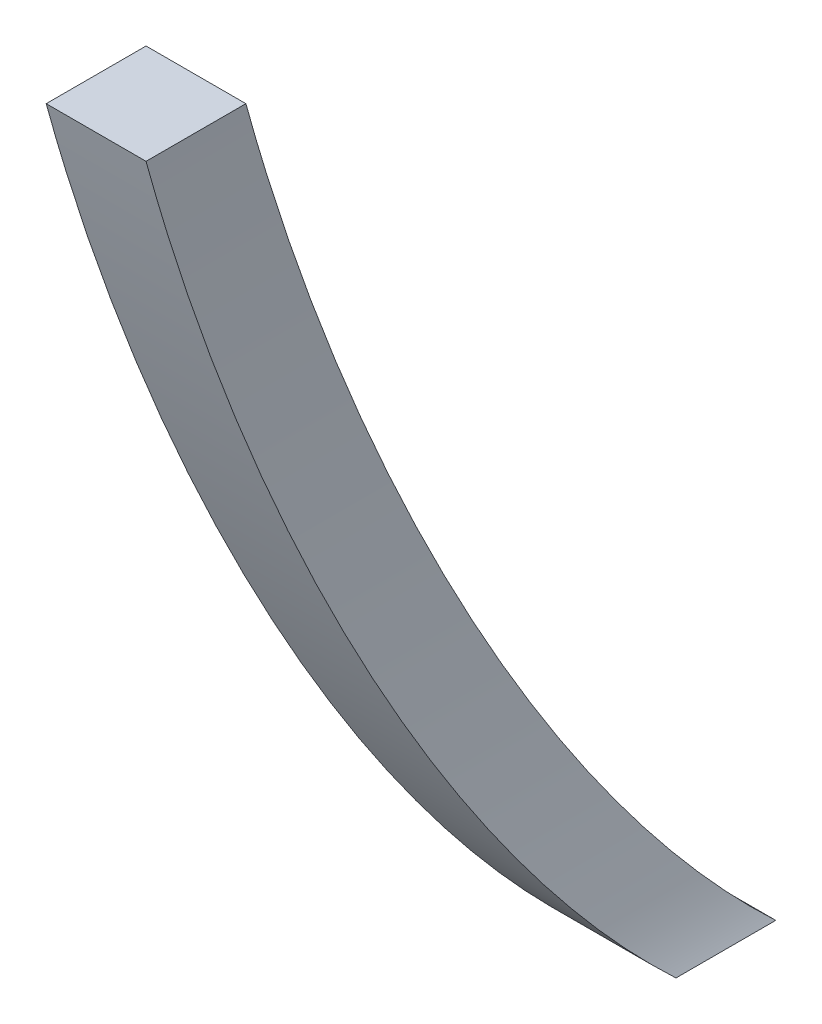
ISO-10303-21;
HEADER;
FILE_DESCRIPTION(('STEP AP214'),'2;1');
FILE_NAME('part.step','',(''),(''),'','','');
FILE_SCHEMA(('AUTOMOTIVE_DESIGN { 1 0 10303 214 1 1 1 1 }'));
ENDSEC;
DATA;
#1=APPLICATION_CONTEXT('core data for automotive mechanical design processes');
#2=APPLICATION_PROTOCOL_DEFINITION('international standard','automotive_design',2000,#1);
#3=PRODUCT_CONTEXT('',#1,'mechanical');
#4=PRODUCT('Part','Part','',(#3));
#5=PRODUCT_RELATED_PRODUCT_CATEGORY('part','',(#4));
#6=PRODUCT_DEFINITION_FORMATION('','',#4);
#7=PRODUCT_DEFINITION_CONTEXT('part definition',#1,'design');
#8=PRODUCT_DEFINITION('design','',#6,#7);
#9=PRODUCT_DEFINITION_SHAPE('','',#8);
#10=(LENGTH_UNIT() NAMED_UNIT(*) SI_UNIT(.MILLI.,.METRE.));
#11=(NAMED_UNIT(*) PLANE_ANGLE_UNIT() SI_UNIT($,.RADIAN.));
#12=(NAMED_UNIT(*) SI_UNIT($,.STERADIAN.) SOLID_ANGLE_UNIT());
#13=UNCERTAINTY_MEASURE_WITH_UNIT(LENGTH_MEASURE(1.E-05),#10,'distance_accuracy_value','');
#14=(GEOMETRIC_REPRESENTATION_CONTEXT(3) GLOBAL_UNCERTAINTY_ASSIGNED_CONTEXT((#13)) GLOBAL_UNIT_ASSIGNED_CONTEXT((#10,
#11,#12)) REPRESENTATION_CONTEXT('',''));
#15=CARTESIAN_POINT('',(0.,0.,0.));
#16=DIRECTION('',(0.,0.,1.));
#17=DIRECTION('',(1.,0.,0.));
#18=AXIS2_PLACEMENT_3D('',#15,#16,#17);
#19=CARTESIAN_POINT('',(0.,0.,0.));
#20=DIRECTION('',(0.,1.,0.));
#21=DIRECTION('',(0.,0.,-1.));
#22=AXIS2_PLACEMENT_3D('',#19,#20,#21);
#23=PLANE('',#22);
#24=DIRECTION('',(0.,0.,-1.));
#25=VECTOR('',#24,1.);
#26=CARTESIAN_POINT('',(15.,0.,15.));
#27=LINE('',#26,#25);
#28=CARTESIAN_POINT('',(15.,0.,15.));
#29=VERTEX_POINT('',#28);
#30=CARTESIAN_POINT('',(15.,0.,-15.));
#31=VERTEX_POINT('',#30);
#32=EDGE_CURVE('E85',#29,#31,#27,.T.);
#33=ORIENTED_EDGE('',*,*,#32,.T.);
#34=DIRECTION('',(-1.,0.,0.));
#35=VECTOR('',#34,1.);
#36=CARTESIAN_POINT('',(-15.,0.,-15.));
#37=LINE('',#36,#35);
#38=CARTESIAN_POINT('',(-15.,0.,-15.));
#39=VERTEX_POINT('',#38);
#40=EDGE_CURVE('E176',#31,#39,#37,.T.);
#41=ORIENTED_EDGE('',*,*,#40,.T.);
#42=DIRECTION('',(0.,0.,1.));
#43=VECTOR('',#42,1.);
#44=CARTESIAN_POINT('',(-15.,0.,15.));
#45=LINE('',#44,#43);
#46=CARTESIAN_POINT('',(-15.,0.,15.));
#47=VERTEX_POINT('',#46);
#48=EDGE_CURVE('E47',#39,#47,#45,.T.);
#49=ORIENTED_EDGE('',*,*,#48,.T.);
#50=DIRECTION('',(1.,0.,0.));
#51=VECTOR('',#50,1.);
#52=CARTESIAN_POINT('',(-15.,0.,15.));
#53=LINE('',#52,#51);
#54=EDGE_CURVE('E11',#47,#29,#53,.T.);
#55=ORIENTED_EDGE('',*,*,#54,.T.);
#56=EDGE_LOOP('',(#33,#41,#49,#55));
#57=FACE_BOUND('',#56,.T.);
#58=ADVANCED_FACE('F37',(#57),#23,.T.);
#59=CARTESIAN_POINT('',(0.,-250.,0.));
#60=DIRECTION('',(0.,1.,0.));
#61=DIRECTION('',(0.,0.,-1.));
#62=AXIS2_PLACEMENT_3D('',#59,#60,#61);
#63=PLANE('',#62);
#64=DIRECTION('',(0.,0.,-1.));
#65=VECTOR('',#64,1.);
#66=CARTESIAN_POINT('',(57.129910507299,-250.,-102.090339112419));
#67=LINE('',#66,#65);
#68=CARTESIAN_POINT('',(57.129910507299,-250.,-102.090339112419));
#69=VERTEX_POINT('',#68);
#70=CARTESIAN_POINT('',(57.129910507299,-250.,-132.090339112419));
#71=VERTEX_POINT('',#70);
#72=EDGE_CURVE('E103',#69,#71,#67,.T.);
#73=ORIENTED_EDGE('',*,*,#72,.F.);
#74=DIRECTION('',(1.,0.,0.));
#75=VECTOR('',#74,1.);
#76=CARTESIAN_POINT('',(27.129910507299,-250.,-102.090339112419));
#77=LINE('',#76,#75);
#78=CARTESIAN_POINT('',(27.129910507299,-250.,-102.090339112419));
#79=VERTEX_POINT('',#78);
#80=EDGE_CURVE('E80',#79,#69,#77,.T.);
#81=ORIENTED_EDGE('',*,*,#80,.F.);
#82=DIRECTION('',(0.,0.,1.));
#83=VECTOR('',#82,1.);
#84=CARTESIAN_POINT('',(27.129910507299,-250.,-102.090339112419));
#85=LINE('',#84,#83);
#86=CARTESIAN_POINT('',(27.129910507299,-250.,-132.090339112419));
#87=VERTEX_POINT('',#86);
#88=EDGE_CURVE('E88',#87,#79,#85,.T.);
#89=ORIENTED_EDGE('',*,*,#88,.F.);
#90=DIRECTION('',(-1.,0.,0.));
#91=VECTOR('',#90,1.);
#92=CARTESIAN_POINT('',(27.129910507299,-250.,-132.090339112419));
#93=LINE('',#92,#91);
#94=EDGE_CURVE('E96',#71,#87,#93,.T.);
#95=ORIENTED_EDGE('',*,*,#94,.F.);
#96=EDGE_LOOP('',(#73,#81,#89,#95));
#97=FACE_BOUND('',#96,.T.);
#98=ADVANCED_FACE('F101',(#97),#63,.F.);
#99=CARTESIAN_POINT('',(57.129910507299,-250.,-102.090339112419));
#100=CARTESIAN_POINT('',(25.0597234393868,-210.441936205879,-58.1589943773229));
#101=CARTESIAN_POINT('',(13.459178000519,-97.1565526695312,-12.590765320135));
#102=CARTESIAN_POINT('',(15.,0.,15.));
#103=CARTESIAN_POINT('',(54.6299105072989,-250.,-102.090339112419));
#104=CARTESIAN_POINT('',(22.5597234393868,-210.441936205879,-58.1589943773229));
#105=CARTESIAN_POINT('',(10.959178000519,-97.1565526695312,-12.590765320135));
#106=CARTESIAN_POINT('',(12.5,0.,15.));
#107=CARTESIAN_POINT('',(49.629910507299,-250.000000000001,-102.090339112419));
#108=CARTESIAN_POINT('',(17.5597234393868,-210.441936205879,-58.1589943773229));
#109=CARTESIAN_POINT('',(5.95917800051906,-97.1565526695314,-12.590765320135));
#110=CARTESIAN_POINT('',(7.5,0.,15.));
#111=CARTESIAN_POINT('',(42.1299105072989,-250.,-102.090339112419));
#112=CARTESIAN_POINT('',(10.0597234393867,-210.441936205878,-58.1589943773229));
#113=CARTESIAN_POINT('',(-1.54082199948099,-97.156552669531,-12.590765320135));
#114=CARTESIAN_POINT('',(0.,0.,15.));
#115=CARTESIAN_POINT('',(34.629910507299,-250.,-102.090339112419));
#116=CARTESIAN_POINT('',(2.5597234393868,-210.441936205879,-58.1589943773229));
#117=CARTESIAN_POINT('',(-9.04082199948095,-97.1565526695313,-12.590765320135));
#118=CARTESIAN_POINT('',(-7.5,0.,15.));
#119=CARTESIAN_POINT('',(29.629910507299,-250.,-102.090339112419));
#120=CARTESIAN_POINT('',(-2.44027656061323,-210.441936205879,-58.1589943773229));
#121=CARTESIAN_POINT('',(-14.040821999481,-97.1565526695312,-12.590765320135));
#122=CARTESIAN_POINT('',(-12.5,0.,15.));
#123=CARTESIAN_POINT('',(27.129910507299,-250.,-102.090339112419));
#124=CARTESIAN_POINT('',(-4.94027656061323,-210.441936205879,-58.1589943773229));
#125=CARTESIAN_POINT('',(-16.540821999481,-97.1565526695312,-12.590765320135));
#126=CARTESIAN_POINT('',(-15.,0.,15.));
#127=B_SPLINE_SURFACE_WITH_KNOTS('',3,3,((#99,#100,#101,#102),(#103,#104,#105,#106),(#107,#108,
#109,#110),(#111,#112,#113,#114),(#115,#116,#117,#118),(#119,#120,#121,#122),(#123,#124,#125,
#126)),.UNSPECIFIED.,.F.,.F.,.F.,(4,1,1,1,4),(4,4),(0.75,0.8125,0.875,0.9375,1.),(0.,1.),.UNSPECIFIED.);
#128=CARTESIAN_POINT('',(57.129910507299,-250.,-102.090339112419));
#129=CARTESIAN_POINT('',(25.0597234393868,-210.441936205879,-58.1589943773229));
#130=CARTESIAN_POINT('',(13.459178000519,-97.1565526695312,-12.590765320135));
#131=CARTESIAN_POINT('',(15.,0.,15.));
#132=B_SPLINE_CURVE_WITH_KNOTS('',3,(#128,#129,#130,#131),.UNSPECIFIED.,.F.,.F.,(4,4),(0.,1.),.UNSPECIFIED.);
#133=EDGE_CURVE('E55',#69,#29,#132,.T.);
#134=CARTESIAN_POINT('',(27.129910507299,-250.,-102.090339112419));
#135=CARTESIAN_POINT('',(-4.94027656061323,-210.441936205879,-58.1589943773229));
#136=CARTESIAN_POINT('',(-16.540821999481,-97.1565526695312,-12.590765320135));
#137=CARTESIAN_POINT('',(-15.,0.,15.));
#138=B_SPLINE_CURVE_WITH_KNOTS('',3,(#134,#135,#136,#137),.UNSPECIFIED.,.F.,.F.,(4,4),(0.,1.),.UNSPECIFIED.);
#139=EDGE_CURVE('E62',#79,#47,#138,.T.);
#140=ORIENTED_EDGE('',*,*,#80,.T.);
#141=ORIENTED_EDGE('',*,*,#133,.T.);
#142=ORIENTED_EDGE('',*,*,#54,.F.);
#143=ORIENTED_EDGE('',*,*,#139,.F.);
#144=EDGE_LOOP('',(#140,#141,#142,#143));
#145=FACE_BOUND('',#144,.T.);
#146=ADVANCED_FACE('F78',(#145),#127,.F.);
#147=CARTESIAN_POINT('',(57.129910507299,-250.,-132.090339112419));
#148=CARTESIAN_POINT('',(25.0597234393868,-210.441936205879,-88.1589943773229));
#149=CARTESIAN_POINT('',(13.459178000519,-97.1565526695312,-42.590765320135));
#150=CARTESIAN_POINT('',(15.,0.,-15.));
#151=CARTESIAN_POINT('',(57.129910507299,-250.,-129.590339112419));
#152=CARTESIAN_POINT('',(25.0597234393868,-210.441936205879,-85.6589943773229));
#153=CARTESIAN_POINT('',(13.459178000519,-97.1565526695312,-40.090765320135));
#154=CARTESIAN_POINT('',(15.,0.,-12.5));
#155=CARTESIAN_POINT('',(57.129910507299,-250.000000000001,-124.590339112419));
#156=CARTESIAN_POINT('',(25.0597234393868,-210.441936205879,-80.658994377323));
#157=CARTESIAN_POINT('',(13.4591780005191,-97.1565526695314,-35.090765320135));
#158=CARTESIAN_POINT('',(15.,0.,-7.5));
#159=CARTESIAN_POINT('',(57.1299105072989,-250.,-117.090339112419));
#160=CARTESIAN_POINT('',(25.0597234393868,-210.441936205878,-73.1589943773229));
#161=CARTESIAN_POINT('',(13.459178000519,-97.156552669531,-27.590765320135));
#162=CARTESIAN_POINT('',(15.,0.,0.));
#163=CARTESIAN_POINT('',(57.129910507299,-250.,-109.590339112419));
#164=CARTESIAN_POINT('',(25.0597234393868,-210.441936205879,-65.6589943773229));
#165=CARTESIAN_POINT('',(13.459178000519,-97.1565526695313,-20.090765320135));
#166=CARTESIAN_POINT('',(15.,0.,7.50000000000001));
#167=CARTESIAN_POINT('',(57.129910507299,-250.,-104.590339112419));
#168=CARTESIAN_POINT('',(25.0597234393868,-210.441936205879,-60.6589943773229));
#169=CARTESIAN_POINT('',(13.459178000519,-97.1565526695312,-15.090765320135));
#170=CARTESIAN_POINT('',(15.,0.,12.5));
#171=CARTESIAN_POINT('',(57.129910507299,-250.,-102.090339112419));
#172=CARTESIAN_POINT('',(25.0597234393868,-210.441936205879,-58.1589943773229));
#173=CARTESIAN_POINT('',(13.459178000519,-97.1565526695312,-12.590765320135));
#174=CARTESIAN_POINT('',(15.,0.,15.));
#175=B_SPLINE_SURFACE_WITH_KNOTS('',3,3,((#147,#148,#149,#150),(#151,#152,#153,#154),(#155,#156,
#157,#158),(#159,#160,#161,#162),(#163,#164,#165,#166),(#167,#168,#169,#170),(#171,#172,#173,
#174)),.UNSPECIFIED.,.F.,.F.,.F.,(4,1,1,1,4),(4,4),(0.5,0.5625,0.625,0.6875,0.75),(0.,1.),.UNSPECIFIED.);
#176=CARTESIAN_POINT('',(57.129910507299,-250.,-132.090339112419));
#177=CARTESIAN_POINT('',(25.0597234393868,-210.441936205879,-88.1589943773229));
#178=CARTESIAN_POINT('',(13.459178000519,-97.1565526695312,-42.590765320135));
#179=CARTESIAN_POINT('',(15.,0.,-15.));
#180=B_SPLINE_CURVE_WITH_KNOTS('',3,(#176,#177,#178,#179),.UNSPECIFIED.,.F.,.F.,(4,4),(0.,1.),.UNSPECIFIED.);
#181=EDGE_CURVE('E187',#71,#31,#180,.T.);
#182=ORIENTED_EDGE('',*,*,#72,.T.);
#183=ORIENTED_EDGE('',*,*,#181,.T.);
#184=ORIENTED_EDGE('',*,*,#32,.F.);
#185=ORIENTED_EDGE('',*,*,#133,.F.);
#186=EDGE_LOOP('',(#182,#183,#184,#185));
#187=FACE_BOUND('',#186,.T.);
#188=ADVANCED_FACE('F186',(#187),#175,.F.);
#189=CARTESIAN_POINT('',(27.129910507299,-250.,-132.090339112419));
#190=CARTESIAN_POINT('',(-4.94027656061323,-210.441936205879,-88.1589943773229));
#191=CARTESIAN_POINT('',(-16.540821999481,-97.1565526695312,-42.590765320135));
#192=CARTESIAN_POINT('',(-15.,0.,-15.));
#193=CARTESIAN_POINT('',(29.629910507299,-250.,-132.090339112419));
#194=CARTESIAN_POINT('',(-2.44027656061323,-210.441936205879,-88.1589943773229));
#195=CARTESIAN_POINT('',(-14.040821999481,-97.1565526695312,-42.590765320135));
#196=CARTESIAN_POINT('',(-12.5,0.,-15.));
#197=CARTESIAN_POINT('',(34.629910507299,-250.,-132.090339112419));
#198=CARTESIAN_POINT('',(2.55972343938677,-210.441936205879,-88.158994377323));
#199=CARTESIAN_POINT('',(-9.04082199948097,-97.1565526695313,-42.590765320135));
#200=CARTESIAN_POINT('',(-7.5,0.,-15.));
#201=CARTESIAN_POINT('',(42.1299105072989,-250.,-132.090339112419));
#202=CARTESIAN_POINT('',(10.0597234393868,-210.441936205879,-88.1589943773229));
#203=CARTESIAN_POINT('',(-1.54082199948097,-97.156552669531,-42.590765320135));
#204=CARTESIAN_POINT('',(0.,0.,-15.));
#205=CARTESIAN_POINT('',(49.629910507299,-250.,-132.090339112419));
#206=CARTESIAN_POINT('',(17.5597234393868,-210.441936205879,-88.158994377323));
#207=CARTESIAN_POINT('',(5.95917800051903,-97.1565526695313,-42.590765320135));
#208=CARTESIAN_POINT('',(7.5,0.,-15.));
#209=CARTESIAN_POINT('',(54.6299105072989,-250.,-132.090339112419));
#210=CARTESIAN_POINT('',(22.5597234393868,-210.441936205879,-88.1589943773229));
#211=CARTESIAN_POINT('',(10.959178000519,-97.1565526695312,-42.590765320135));
#212=CARTESIAN_POINT('',(12.5,0.,-15.));
#213=CARTESIAN_POINT('',(57.129910507299,-250.,-132.090339112419));
#214=CARTESIAN_POINT('',(25.0597234393868,-210.441936205879,-88.1589943773229));
#215=CARTESIAN_POINT('',(13.459178000519,-97.1565526695312,-42.590765320135));
#216=CARTESIAN_POINT('',(15.,0.,-15.));
#217=B_SPLINE_SURFACE_WITH_KNOTS('',3,3,((#189,#190,#191,#192),(#193,#194,#195,#196),(#197,#198,
#199,#200),(#201,#202,#203,#204),(#205,#206,#207,#208),(#209,#210,#211,#212),(#213,#214,#215,
#216)),.UNSPECIFIED.,.F.,.F.,.F.,(4,1,1,1,4),(4,4),(0.25,0.3125,0.375,0.4375,0.5),(0.,1.),.UNSPECIFIED.);
#218=CARTESIAN_POINT('',(27.129910507299,-250.,-132.090339112419));
#219=CARTESIAN_POINT('',(-4.94027656061323,-210.441936205879,-88.1589943773229));
#220=CARTESIAN_POINT('',(-16.540821999481,-97.1565526695312,-42.590765320135));
#221=CARTESIAN_POINT('',(-15.,0.,-15.));
#222=B_SPLINE_CURVE_WITH_KNOTS('',3,(#218,#219,#220,#221),.UNSPECIFIED.,.F.,.F.,(4,4),(0.,1.),.UNSPECIFIED.);
#223=EDGE_CURVE('E91',#87,#39,#222,.T.);
#224=ORIENTED_EDGE('',*,*,#94,.T.);
#225=ORIENTED_EDGE('',*,*,#223,.T.);
#226=ORIENTED_EDGE('',*,*,#40,.F.);
#227=ORIENTED_EDGE('',*,*,#181,.F.);
#228=EDGE_LOOP('',(#224,#225,#226,#227));
#229=FACE_BOUND('',#228,.T.);
#230=ADVANCED_FACE('F206',(#229),#217,.F.);
#231=CARTESIAN_POINT('',(27.129910507299,-250.,-102.090339112419));
#232=CARTESIAN_POINT('',(-4.94027656061323,-210.441936205879,-58.1589943773229));
#233=CARTESIAN_POINT('',(-16.540821999481,-97.1565526695312,-12.590765320135));
#234=CARTESIAN_POINT('',(-15.,0.,15.));
#235=CARTESIAN_POINT('',(27.129910507299,-250.,-104.590339112419));
#236=CARTESIAN_POINT('',(-4.94027656061322,-210.441936205879,-60.6589943773229));
#237=CARTESIAN_POINT('',(-16.540821999481,-97.1565526695312,-15.090765320135));
#238=CARTESIAN_POINT('',(-15.,0.,12.5));
#239=CARTESIAN_POINT('',(27.129910507299,-250.000000000001,-109.590339112419));
#240=CARTESIAN_POINT('',(-4.9402765606132,-210.441936205879,-65.658994377323));
#241=CARTESIAN_POINT('',(-16.540821999481,-97.1565526695313,-20.090765320135));
#242=CARTESIAN_POINT('',(-15.,0.,7.50000000000001));
#243=CARTESIAN_POINT('',(27.1299105072989,-250.,-117.090339112419));
#244=CARTESIAN_POINT('',(-4.94027656061327,-210.441936205879,-73.1589943773229));
#245=CARTESIAN_POINT('',(-16.540821999481,-97.156552669531,-27.590765320135));
#246=CARTESIAN_POINT('',(-15.,0.,0.));
#247=CARTESIAN_POINT('',(27.129910507299,-250.,-124.590339112419));
#248=CARTESIAN_POINT('',(-4.94027656061319,-210.441936205879,-80.658994377323));
#249=CARTESIAN_POINT('',(-16.540821999481,-97.1565526695313,-35.090765320135));
#250=CARTESIAN_POINT('',(-15.,0.,-7.5));
#251=CARTESIAN_POINT('',(27.129910507299,-250.,-129.590339112419));
#252=CARTESIAN_POINT('',(-4.94027656061323,-210.441936205879,-85.6589943773229));
#253=CARTESIAN_POINT('',(-16.540821999481,-97.1565526695312,-40.090765320135));
#254=CARTESIAN_POINT('',(-15.,0.,-12.5));
#255=CARTESIAN_POINT('',(27.129910507299,-250.,-132.090339112419));
#256=CARTESIAN_POINT('',(-4.94027656061323,-210.441936205879,-88.1589943773229));
#257=CARTESIAN_POINT('',(-16.540821999481,-97.1565526695312,-42.590765320135));
#258=CARTESIAN_POINT('',(-15.,0.,-15.));
#259=B_SPLINE_SURFACE_WITH_KNOTS('',3,3,((#231,#232,#233,#234),(#235,#236,#237,#238),(#239,#240,
#241,#242),(#243,#244,#245,#246),(#247,#248,#249,#250),(#251,#252,#253,#254),(#255,#256,#257,
#258)),.UNSPECIFIED.,.F.,.F.,.F.,(4,1,1,1,4),(4,4),(0.,0.0625,0.125,0.1875,0.25),(0.,1.),.UNSPECIFIED.);
#260=ORIENTED_EDGE('',*,*,#88,.T.);
#261=ORIENTED_EDGE('',*,*,#139,.T.);
#262=ORIENTED_EDGE('',*,*,#48,.F.);
#263=ORIENTED_EDGE('',*,*,#223,.F.);
#264=EDGE_LOOP('',(#260,#261,#262,#263));
#265=FACE_BOUND('',#264,.T.);
#266=ADVANCED_FACE('F90',(#265),#259,.F.);
#267=CLOSED_SHELL('',(#58,#98,#146,#188,#230,#266));
#268=MANIFOLD_SOLID_BREP('B2',#267);
#269=ADVANCED_BREP_SHAPE_REPRESENTATION('',(#18,#268),#14);
#270=SHAPE_DEFINITION_REPRESENTATION(#9,#269);
ENDSEC;
END-ISO-10303-21;
